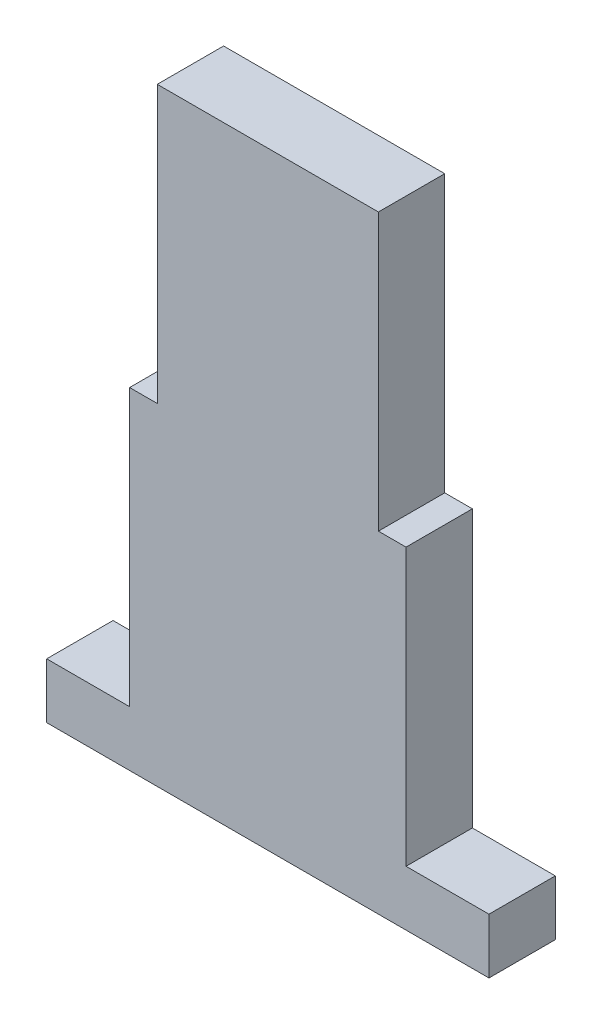
ISO-10303-21;
HEADER;
FILE_DESCRIPTION(('STEP AP214'),'2;1');
FILE_NAME('part.step','',(''),(''),'','','');
FILE_SCHEMA(('AUTOMOTIVE_DESIGN { 1 0 10303 214 1 1 1 1 }'));
ENDSEC;
DATA;
#1=APPLICATION_CONTEXT('core data for automotive mechanical design processes');
#2=APPLICATION_PROTOCOL_DEFINITION('international standard','automotive_design',2000,#1);
#3=PRODUCT_CONTEXT('',#1,'mechanical');
#4=PRODUCT('Part','Part','',(#3));
#5=PRODUCT_RELATED_PRODUCT_CATEGORY('part','',(#4));
#6=PRODUCT_DEFINITION_FORMATION('','',#4);
#7=PRODUCT_DEFINITION_CONTEXT('part definition',#1,'design');
#8=PRODUCT_DEFINITION('design','',#6,#7);
#9=PRODUCT_DEFINITION_SHAPE('','',#8);
#10=(LENGTH_UNIT() NAMED_UNIT(*) SI_UNIT(.MILLI.,.METRE.));
#11=(NAMED_UNIT(*) PLANE_ANGLE_UNIT() SI_UNIT($,.RADIAN.));
#12=(NAMED_UNIT(*) SI_UNIT($,.STERADIAN.) SOLID_ANGLE_UNIT());
#13=UNCERTAINTY_MEASURE_WITH_UNIT(LENGTH_MEASURE(1.E-05),#10,'distance_accuracy_value','');
#14=(GEOMETRIC_REPRESENTATION_CONTEXT(3) GLOBAL_UNCERTAINTY_ASSIGNED_CONTEXT((#13)) GLOBAL_UNIT_ASSIGNED_CONTEXT((#10,
#11,#12)) REPRESENTATION_CONTEXT('',''));
#15=CARTESIAN_POINT('',(0.,0.,0.));
#16=DIRECTION('',(0.,0.,1.));
#17=DIRECTION('',(1.,0.,0.));
#18=AXIS2_PLACEMENT_3D('',#15,#16,#17);
#19=CARTESIAN_POINT('',(-4.,0.,0.6));
#20=DIRECTION('',(0.,-1.,0.));
#21=DIRECTION('',(1.,0.,0.));
#22=AXIS2_PLACEMENT_3D('',#19,#20,#21);
#23=PLANE('',#22);
#24=DIRECTION('',(-1.,0.,0.));
#25=VECTOR('',#24,1.);
#26=CARTESIAN_POINT('',(-4.,0.,-0.6));
#27=LINE('',#26,#25);
#28=CARTESIAN_POINT('',(-2.5,0.,-0.6));
#29=VERTEX_POINT('',#28);
#30=CARTESIAN_POINT('',(-4.,0.,-0.6));
#31=VERTEX_POINT('',#30);
#32=EDGE_CURVE('E152',#29,#31,#27,.T.);
#33=ORIENTED_EDGE('',*,*,#32,.T.);
#34=DIRECTION('',(0.,0.,-1.));
#35=VECTOR('',#34,1.);
#36=CARTESIAN_POINT('',(-4.,0.,0.6));
#37=LINE('',#36,#35);
#38=CARTESIAN_POINT('',(-4.,0.,0.6));
#39=VERTEX_POINT('',#38);
#40=EDGE_CURVE('E11',#39,#31,#37,.T.);
#41=ORIENTED_EDGE('',*,*,#40,.F.);
#42=DIRECTION('',(-1.,0.,0.));
#43=VECTOR('',#42,1.);
#44=CARTESIAN_POINT('',(-4.,0.,0.6));
#45=LINE('',#44,#43);
#46=CARTESIAN_POINT('',(-2.5,0.,0.6));
#47=VERTEX_POINT('',#46);
#48=EDGE_CURVE('E174',#47,#39,#45,.T.);
#49=ORIENTED_EDGE('',*,*,#48,.F.);
#50=DIRECTION('',(0.,0.,-1.));
#51=VECTOR('',#50,1.);
#52=CARTESIAN_POINT('',(-2.5,0.,0.6));
#53=LINE('',#52,#51);
#54=EDGE_CURVE('E148',#47,#29,#53,.T.);
#55=ORIENTED_EDGE('',*,*,#54,.T.);
#56=EDGE_LOOP('',(#33,#41,#49,#55));
#57=FACE_BOUND('',#56,.T.);
#58=ADVANCED_FACE('F32',(#57),#23,.F.);
#59=CARTESIAN_POINT('',(-4.,0.,0.6));
#60=DIRECTION('',(1.,0.,0.));
#61=DIRECTION('',(0.,0.,-1.));
#62=AXIS2_PLACEMENT_3D('',#59,#60,#61);
#63=PLANE('',#62);
#64=DIRECTION('',(0.,-1.,0.));
#65=VECTOR('',#64,1.);
#66=CARTESIAN_POINT('',(-4.,0.,-0.6));
#67=LINE('',#66,#65);
#68=CARTESIAN_POINT('',(-4.,-0.999999999999992,-0.6));
#69=VERTEX_POINT('',#68);
#70=EDGE_CURVE('E155',#31,#69,#67,.T.);
#71=ORIENTED_EDGE('',*,*,#70,.T.);
#72=DIRECTION('',(0.,0.,-1.));
#73=VECTOR('',#72,1.);
#74=CARTESIAN_POINT('',(-4.,-0.999999999999992,0.6));
#75=LINE('',#74,#73);
#76=CARTESIAN_POINT('',(-4.,-0.999999999999992,0.6));
#77=VERTEX_POINT('',#76);
#78=EDGE_CURVE('E40',#77,#69,#75,.T.);
#79=ORIENTED_EDGE('',*,*,#78,.F.);
#80=DIRECTION('',(0.,-1.,0.));
#81=VECTOR('',#80,1.);
#82=CARTESIAN_POINT('',(-4.,0.,0.6));
#83=LINE('',#82,#81);
#84=EDGE_CURVE('E103',#39,#77,#83,.T.);
#85=ORIENTED_EDGE('',*,*,#84,.F.);
#86=ORIENTED_EDGE('',*,*,#40,.T.);
#87=EDGE_LOOP('',(#71,#79,#85,#86));
#88=FACE_BOUND('',#87,.T.);
#89=ADVANCED_FACE('F252',(#88),#63,.F.);
#90=CARTESIAN_POINT('',(-4.,-0.999999999999992,0.6));
#91=DIRECTION('',(0.,1.,0.));
#92=DIRECTION('',(-1.,0.,0.));
#93=AXIS2_PLACEMENT_3D('',#90,#91,#92);
#94=PLANE('',#93);
#95=DIRECTION('',(1.,0.,0.));
#96=VECTOR('',#95,1.);
#97=CARTESIAN_POINT('',(-4.,-0.999999999999992,-0.6));
#98=LINE('',#97,#96);
#99=CARTESIAN_POINT('',(4.,-0.999999999999993,-0.6));
#100=VERTEX_POINT('',#99);
#101=EDGE_CURVE('E157',#69,#100,#98,.T.);
#102=ORIENTED_EDGE('',*,*,#101,.T.);
#103=DIRECTION('',(0.,0.,-1.));
#104=VECTOR('',#103,1.);
#105=CARTESIAN_POINT('',(4.,-0.999999999999993,0.6));
#106=LINE('',#105,#104);
#107=CARTESIAN_POINT('',(4.,-0.999999999999993,0.6));
#108=VERTEX_POINT('',#107);
#109=EDGE_CURVE('E193',#108,#100,#106,.T.);
#110=ORIENTED_EDGE('',*,*,#109,.F.);
#111=DIRECTION('',(1.,0.,0.));
#112=VECTOR('',#111,1.);
#113=CARTESIAN_POINT('',(-4.,-0.999999999999992,0.6));
#114=LINE('',#113,#112);
#115=EDGE_CURVE('E201',#77,#108,#114,.T.);
#116=ORIENTED_EDGE('',*,*,#115,.F.);
#117=ORIENTED_EDGE('',*,*,#78,.T.);
#118=EDGE_LOOP('',(#102,#110,#116,#117));
#119=FACE_BOUND('',#118,.T.);
#120=ADVANCED_FACE('F199',(#119),#94,.F.);
#121=CARTESIAN_POINT('',(4.,0.,0.6));
#122=DIRECTION('',(-1.,0.,0.));
#123=DIRECTION('',(0.,0.,1.));
#124=AXIS2_PLACEMENT_3D('',#121,#122,#123);
#125=PLANE('',#124);
#126=DIRECTION('',(0.,1.,0.));
#127=VECTOR('',#126,1.);
#128=CARTESIAN_POINT('',(4.,0.,-0.6));
#129=LINE('',#128,#127);
#130=CARTESIAN_POINT('',(4.,0.,-0.6));
#131=VERTEX_POINT('',#130);
#132=EDGE_CURVE('E159',#100,#131,#129,.T.);
#133=ORIENTED_EDGE('',*,*,#132,.T.);
#134=DIRECTION('',(0.,0.,-1.));
#135=VECTOR('',#134,1.);
#136=CARTESIAN_POINT('',(4.,0.,0.6));
#137=LINE('',#136,#135);
#138=CARTESIAN_POINT('',(4.,0.,0.6));
#139=VERTEX_POINT('',#138);
#140=EDGE_CURVE('E190',#139,#131,#137,.T.);
#141=ORIENTED_EDGE('',*,*,#140,.F.);
#142=DIRECTION('',(0.,1.,0.));
#143=VECTOR('',#142,1.);
#144=CARTESIAN_POINT('',(4.,0.,0.6));
#145=LINE('',#144,#143);
#146=EDGE_CURVE('E219',#108,#139,#145,.T.);
#147=ORIENTED_EDGE('',*,*,#146,.F.);
#148=ORIENTED_EDGE('',*,*,#109,.T.);
#149=EDGE_LOOP('',(#133,#141,#147,#148));
#150=FACE_BOUND('',#149,.T.);
#151=ADVANCED_FACE('F210',(#150),#125,.F.);
#152=CARTESIAN_POINT('',(2.5,0.,0.6));
#153=DIRECTION('',(0.,-1.,0.));
#154=DIRECTION('',(0.,0.,-1.));
#155=AXIS2_PLACEMENT_3D('',#152,#153,#154);
#156=PLANE('',#155);
#157=DIRECTION('',(-1.,0.,0.));
#158=VECTOR('',#157,1.);
#159=CARTESIAN_POINT('',(2.5,0.,-0.6));
#160=LINE('',#159,#158);
#161=CARTESIAN_POINT('',(2.5,0.,-0.6));
#162=VERTEX_POINT('',#161);
#163=EDGE_CURVE('E161',#131,#162,#160,.T.);
#164=ORIENTED_EDGE('',*,*,#163,.T.);
#165=DIRECTION('',(0.,0.,-1.));
#166=VECTOR('',#165,1.);
#167=CARTESIAN_POINT('',(2.5,0.,0.6));
#168=LINE('',#167,#166);
#169=CARTESIAN_POINT('',(2.5,0.,0.6));
#170=VERTEX_POINT('',#169);
#171=EDGE_CURVE('E187',#170,#162,#168,.T.);
#172=ORIENTED_EDGE('',*,*,#171,.F.);
#173=DIRECTION('',(-1.,0.,0.));
#174=VECTOR('',#173,1.);
#175=CARTESIAN_POINT('',(2.5,0.,0.6));
#176=LINE('',#175,#174);
#177=EDGE_CURVE('E216',#139,#170,#176,.T.);
#178=ORIENTED_EDGE('',*,*,#177,.F.);
#179=ORIENTED_EDGE('',*,*,#140,.T.);
#180=EDGE_LOOP('',(#164,#172,#178,#179));
#181=FACE_BOUND('',#180,.T.);
#182=ADVANCED_FACE('F214',(#181),#156,.F.);
#183=CARTESIAN_POINT('',(2.5,0.,0.6));
#184=DIRECTION('',(-1.,0.,0.));
#185=DIRECTION('',(0.,0.,1.));
#186=AXIS2_PLACEMENT_3D('',#183,#184,#185);
#187=PLANE('',#186);
#188=DIRECTION('',(0.,1.,0.));
#189=VECTOR('',#188,1.);
#190=CARTESIAN_POINT('',(2.5,0.,-0.6));
#191=LINE('',#190,#189);
#192=CARTESIAN_POINT('',(2.5,5.,-0.6));
#193=VERTEX_POINT('',#192);
#194=EDGE_CURVE('E163',#162,#193,#191,.T.);
#195=ORIENTED_EDGE('',*,*,#194,.T.);
#196=DIRECTION('',(0.,0.,-1.));
#197=VECTOR('',#196,1.);
#198=CARTESIAN_POINT('',(2.5,5.,0.6));
#199=LINE('',#198,#197);
#200=CARTESIAN_POINT('',(2.5,5.,0.6));
#201=VERTEX_POINT('',#200);
#202=EDGE_CURVE('E184',#201,#193,#199,.T.);
#203=ORIENTED_EDGE('',*,*,#202,.F.);
#204=DIRECTION('',(0.,1.,0.));
#205=VECTOR('',#204,1.);
#206=CARTESIAN_POINT('',(2.5,0.,0.6));
#207=LINE('',#206,#205);
#208=EDGE_CURVE('E218',#170,#201,#207,.T.);
#209=ORIENTED_EDGE('',*,*,#208,.F.);
#210=ORIENTED_EDGE('',*,*,#171,.T.);
#211=EDGE_LOOP('',(#195,#203,#209,#210));
#212=FACE_BOUND('',#211,.T.);
#213=ADVANCED_FACE('F265',(#212),#187,.F.);
#214=CARTESIAN_POINT('',(2.,5.,0.6));
#215=DIRECTION('',(0.,-1.,0.));
#216=DIRECTION('',(1.,0.,0.));
#217=AXIS2_PLACEMENT_3D('',#214,#215,#216);
#218=PLANE('',#217);
#219=DIRECTION('',(-1.,0.,0.));
#220=VECTOR('',#219,1.);
#221=CARTESIAN_POINT('',(2.,5.,-0.6));
#222=LINE('',#221,#220);
#223=CARTESIAN_POINT('',(2.,5.,-0.6));
#224=VERTEX_POINT('',#223);
#225=EDGE_CURVE('E165',#193,#224,#222,.T.);
#226=ORIENTED_EDGE('',*,*,#225,.T.);
#227=DIRECTION('',(0.,0.,-1.));
#228=VECTOR('',#227,1.);
#229=CARTESIAN_POINT('',(2.,5.,0.6));
#230=LINE('',#229,#228);
#231=CARTESIAN_POINT('',(2.,5.,0.6));
#232=VERTEX_POINT('',#231);
#233=EDGE_CURVE('E181',#232,#224,#230,.T.);
#234=ORIENTED_EDGE('',*,*,#233,.F.);
#235=DIRECTION('',(-1.,0.,0.));
#236=VECTOR('',#235,1.);
#237=CARTESIAN_POINT('',(2.,5.,0.6));
#238=LINE('',#237,#236);
#239=EDGE_CURVE('E221',#201,#232,#238,.T.);
#240=ORIENTED_EDGE('',*,*,#239,.F.);
#241=ORIENTED_EDGE('',*,*,#202,.T.);
#242=EDGE_LOOP('',(#226,#234,#240,#241));
#243=FACE_BOUND('',#242,.T.);
#244=ADVANCED_FACE('F268',(#243),#218,.F.);
#245=CARTESIAN_POINT('',(2.,5.,0.6));
#246=DIRECTION('',(-1.,0.,0.));
#247=DIRECTION('',(0.,0.,1.));
#248=AXIS2_PLACEMENT_3D('',#245,#246,#247);
#249=PLANE('',#248);
#250=DIRECTION('',(0.,1.,0.));
#251=VECTOR('',#250,1.);
#252=CARTESIAN_POINT('',(2.,5.,-0.6));
#253=LINE('',#252,#251);
#254=CARTESIAN_POINT('',(2.,10.,-0.6));
#255=VERTEX_POINT('',#254);
#256=EDGE_CURVE('E167',#224,#255,#253,.T.);
#257=ORIENTED_EDGE('',*,*,#256,.T.);
#258=DIRECTION('',(0.,0.,-1.));
#259=VECTOR('',#258,1.);
#260=CARTESIAN_POINT('',(2.,10.,0.6));
#261=LINE('',#260,#259);
#262=CARTESIAN_POINT('',(2.,10.,0.6));
#263=VERTEX_POINT('',#262);
#264=EDGE_CURVE('E178',#263,#255,#261,.T.);
#265=ORIENTED_EDGE('',*,*,#264,.F.);
#266=DIRECTION('',(0.,1.,0.));
#267=VECTOR('',#266,1.);
#268=CARTESIAN_POINT('',(2.,5.,0.6));
#269=LINE('',#268,#267);
#270=EDGE_CURVE('E227',#232,#263,#269,.T.);
#271=ORIENTED_EDGE('',*,*,#270,.F.);
#272=ORIENTED_EDGE('',*,*,#233,.T.);
#273=EDGE_LOOP('',(#257,#265,#271,#272));
#274=FACE_BOUND('',#273,.T.);
#275=ADVANCED_FACE('F233',(#274),#249,.F.);
#276=CARTESIAN_POINT('',(2.,10.,0.6));
#277=DIRECTION('',(0.,-1.,0.));
#278=DIRECTION('',(1.,0.,0.));
#279=AXIS2_PLACEMENT_3D('',#276,#277,#278);
#280=PLANE('',#279);
#281=DIRECTION('',(-1.,0.,0.));
#282=VECTOR('',#281,1.);
#283=CARTESIAN_POINT('',(2.,10.,-0.6));
#284=LINE('',#283,#282);
#285=CARTESIAN_POINT('',(-2.,10.,-0.6));
#286=VERTEX_POINT('',#285);
#287=EDGE_CURVE('E169',#255,#286,#284,.T.);
#288=ORIENTED_EDGE('',*,*,#287,.T.);
#289=DIRECTION('',(0.,0.,-1.));
#290=VECTOR('',#289,1.);
#291=CARTESIAN_POINT('',(-2.,10.,0.6));
#292=LINE('',#291,#290);
#293=CARTESIAN_POINT('',(-2.,10.,0.6));
#294=VERTEX_POINT('',#293);
#295=EDGE_CURVE('E143',#294,#286,#292,.T.);
#296=ORIENTED_EDGE('',*,*,#295,.F.);
#297=DIRECTION('',(-1.,0.,0.));
#298=VECTOR('',#297,1.);
#299=CARTESIAN_POINT('',(2.,10.,0.6));
#300=LINE('',#299,#298);
#301=EDGE_CURVE('E134',#263,#294,#300,.T.);
#302=ORIENTED_EDGE('',*,*,#301,.F.);
#303=ORIENTED_EDGE('',*,*,#264,.T.);
#304=EDGE_LOOP('',(#288,#296,#302,#303));
#305=FACE_BOUND('',#304,.T.);
#306=ADVANCED_FACE('F237',(#305),#280,.F.);
#307=CARTESIAN_POINT('',(-2.,5.,0.6));
#308=DIRECTION('',(1.,0.,0.));
#309=DIRECTION('',(0.,1.,0.));
#310=AXIS2_PLACEMENT_3D('',#307,#308,#309);
#311=PLANE('',#310);
#312=DIRECTION('',(0.,-1.,0.));
#313=VECTOR('',#312,1.);
#314=CARTESIAN_POINT('',(-2.,5.,-0.6));
#315=LINE('',#314,#313);
#316=CARTESIAN_POINT('',(-2.,5.,-0.6));
#317=VERTEX_POINT('',#316);
#318=EDGE_CURVE('E142',#286,#317,#315,.T.);
#319=ORIENTED_EDGE('',*,*,#318,.T.);
#320=DIRECTION('',(0.,0.,-1.));
#321=VECTOR('',#320,1.);
#322=CARTESIAN_POINT('',(-2.,5.,0.6));
#323=LINE('',#322,#321);
#324=CARTESIAN_POINT('',(-2.,5.,0.6));
#325=VERTEX_POINT('',#324);
#326=EDGE_CURVE('E139',#325,#317,#323,.T.);
#327=ORIENTED_EDGE('',*,*,#326,.F.);
#328=DIRECTION('',(0.,-1.,0.));
#329=VECTOR('',#328,1.);
#330=CARTESIAN_POINT('',(-2.,5.,0.6));
#331=LINE('',#330,#329);
#332=EDGE_CURVE('E128',#294,#325,#331,.T.);
#333=ORIENTED_EDGE('',*,*,#332,.F.);
#334=ORIENTED_EDGE('',*,*,#295,.T.);
#335=EDGE_LOOP('',(#319,#327,#333,#334));
#336=FACE_BOUND('',#335,.T.);
#337=ADVANCED_FACE('F140',(#336),#311,.F.);
#338=CARTESIAN_POINT('',(-2.5,5.,0.6));
#339=DIRECTION('',(0.,-1.,0.));
#340=DIRECTION('',(0.,0.,-1.));
#341=AXIS2_PLACEMENT_3D('',#338,#339,#340);
#342=PLANE('',#341);
#343=DIRECTION('',(-1.,0.,0.));
#344=VECTOR('',#343,1.);
#345=CARTESIAN_POINT('',(-2.5,5.,-0.6));
#346=LINE('',#345,#344);
#347=CARTESIAN_POINT('',(-2.5,5.,-0.6));
#348=VERTEX_POINT('',#347);
#349=EDGE_CURVE('E89',#317,#348,#346,.T.);
#350=ORIENTED_EDGE('',*,*,#349,.T.);
#351=DIRECTION('',(0.,0.,-1.));
#352=VECTOR('',#351,1.);
#353=CARTESIAN_POINT('',(-2.5,5.,0.6));
#354=LINE('',#353,#352);
#355=CARTESIAN_POINT('',(-2.5,5.,0.6));
#356=VERTEX_POINT('',#355);
#357=EDGE_CURVE('E144',#356,#348,#354,.T.);
#358=ORIENTED_EDGE('',*,*,#357,.F.);
#359=DIRECTION('',(-1.,0.,0.));
#360=VECTOR('',#359,1.);
#361=CARTESIAN_POINT('',(-2.5,5.,0.6));
#362=LINE('',#361,#360);
#363=EDGE_CURVE('E132',#325,#356,#362,.T.);
#364=ORIENTED_EDGE('',*,*,#363,.F.);
#365=ORIENTED_EDGE('',*,*,#326,.T.);
#366=EDGE_LOOP('',(#350,#358,#364,#365));
#367=FACE_BOUND('',#366,.T.);
#368=ADVANCED_FACE('F146',(#367),#342,.F.);
#369=CARTESIAN_POINT('',(-2.5,0.,0.6));
#370=DIRECTION('',(1.,0.,0.));
#371=DIRECTION('',(0.,0.,-1.));
#372=AXIS2_PLACEMENT_3D('',#369,#370,#371);
#373=PLANE('',#372);
#374=DIRECTION('',(0.,-1.,0.));
#375=VECTOR('',#374,1.);
#376=CARTESIAN_POINT('',(-2.5,0.,-0.6));
#377=LINE('',#376,#375);
#378=EDGE_CURVE('E95',#348,#29,#377,.T.);
#379=ORIENTED_EDGE('',*,*,#378,.T.);
#380=ORIENTED_EDGE('',*,*,#54,.F.);
#381=DIRECTION('',(0.,-1.,0.));
#382=VECTOR('',#381,1.);
#383=CARTESIAN_POINT('',(-2.5,0.,0.6));
#384=LINE('',#383,#382);
#385=EDGE_CURVE('E48',#356,#47,#384,.T.);
#386=ORIENTED_EDGE('',*,*,#385,.F.);
#387=ORIENTED_EDGE('',*,*,#357,.T.);
#388=EDGE_LOOP('',(#379,#380,#386,#387));
#389=FACE_BOUND('',#388,.T.);
#390=ADVANCED_FACE('F241',(#389),#373,.F.);
#391=CARTESIAN_POINT('',(0.,0.,0.6));
#392=DIRECTION('',(0.,0.,1.));
#393=DIRECTION('',(1.,0.,0.));
#394=AXIS2_PLACEMENT_3D('',#391,#392,#393);
#395=PLANE('',#394);
#396=ORIENTED_EDGE('',*,*,#48,.T.);
#397=ORIENTED_EDGE('',*,*,#84,.T.);
#398=ORIENTED_EDGE('',*,*,#115,.T.);
#399=ORIENTED_EDGE('',*,*,#146,.T.);
#400=ORIENTED_EDGE('',*,*,#177,.T.);
#401=ORIENTED_EDGE('',*,*,#208,.T.);
#402=ORIENTED_EDGE('',*,*,#239,.T.);
#403=ORIENTED_EDGE('',*,*,#270,.T.);
#404=ORIENTED_EDGE('',*,*,#301,.T.);
#405=ORIENTED_EDGE('',*,*,#332,.T.);
#406=ORIENTED_EDGE('',*,*,#363,.T.);
#407=ORIENTED_EDGE('',*,*,#385,.T.);
#408=EDGE_LOOP('',(#396,#397,#398,#399,#400,#401,#402,#403,#404,#405,#406,#407));
#409=FACE_BOUND('',#408,.T.);
#410=ADVANCED_FACE('F130',(#409),#395,.T.);
#411=CARTESIAN_POINT('',(0.,0.,-0.6));
#412=DIRECTION('',(0.,0.,1.));
#413=DIRECTION('',(1.,0.,0.));
#414=AXIS2_PLACEMENT_3D('',#411,#412,#413);
#415=PLANE('',#414);
#416=ORIENTED_EDGE('',*,*,#32,.F.);
#417=ORIENTED_EDGE('',*,*,#378,.F.);
#418=ORIENTED_EDGE('',*,*,#349,.F.);
#419=ORIENTED_EDGE('',*,*,#318,.F.);
#420=ORIENTED_EDGE('',*,*,#287,.F.);
#421=ORIENTED_EDGE('',*,*,#256,.F.);
#422=ORIENTED_EDGE('',*,*,#225,.F.);
#423=ORIENTED_EDGE('',*,*,#194,.F.);
#424=ORIENTED_EDGE('',*,*,#163,.F.);
#425=ORIENTED_EDGE('',*,*,#132,.F.);
#426=ORIENTED_EDGE('',*,*,#101,.F.);
#427=ORIENTED_EDGE('',*,*,#70,.F.);
#428=EDGE_LOOP('',(#416,#417,#418,#419,#420,#421,#422,#423,#424,#425,#426,#427));
#429=FACE_BOUND('',#428,.T.);
#430=ADVANCED_FACE('F205',(#429),#415,.F.);
#431=CLOSED_SHELL('',(#58,#89,#120,#151,#182,#213,#244,#275,#306,#337,#368,#390,#410,#430));
#432=MANIFOLD_SOLID_BREP('B2',#431);
#433=ADVANCED_BREP_SHAPE_REPRESENTATION('',(#18,#432),#14);
#434=SHAPE_DEFINITION_REPRESENTATION(#9,#433);
ENDSEC;
END-ISO-10303-21;
